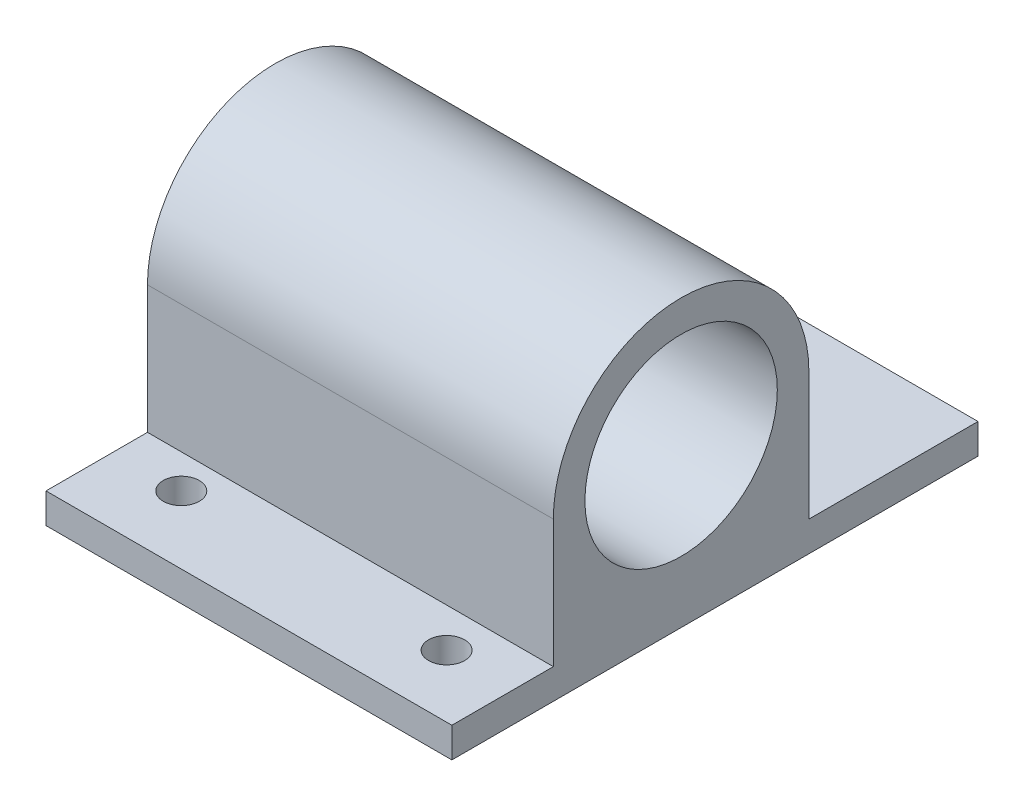
ISO-10303-21;
HEADER;
FILE_DESCRIPTION(('STEP AP214'),'2;1');
FILE_NAME('part.step','',(''),(''),'','','');
FILE_SCHEMA(('AUTOMOTIVE_DESIGN { 1 0 10303 214 1 1 1 1 }'));
ENDSEC;
DATA;
#1=APPLICATION_CONTEXT('core data for automotive mechanical design processes');
#2=APPLICATION_PROTOCOL_DEFINITION('international standard','automotive_design',2000,#1);
#3=PRODUCT_CONTEXT('',#1,'mechanical');
#4=PRODUCT('Part','Part','',(#3));
#5=PRODUCT_RELATED_PRODUCT_CATEGORY('part','',(#4));
#6=PRODUCT_DEFINITION_FORMATION('','',#4);
#7=PRODUCT_DEFINITION_CONTEXT('part definition',#1,'design');
#8=PRODUCT_DEFINITION('design','',#6,#7);
#9=PRODUCT_DEFINITION_SHAPE('','',#8);
#10=(LENGTH_UNIT() NAMED_UNIT(*) SI_UNIT(.MILLI.,.METRE.));
#11=(NAMED_UNIT(*) PLANE_ANGLE_UNIT() SI_UNIT($,.RADIAN.));
#12=(NAMED_UNIT(*) SI_UNIT($,.STERADIAN.) SOLID_ANGLE_UNIT());
#13=UNCERTAINTY_MEASURE_WITH_UNIT(LENGTH_MEASURE(1.E-05),#10,'distance_accuracy_value','');
#14=(GEOMETRIC_REPRESENTATION_CONTEXT(3) GLOBAL_UNCERTAINTY_ASSIGNED_CONTEXT((#13)) GLOBAL_UNIT_ASSIGNED_CONTEXT((#10,
#11,#12)) REPRESENTATION_CONTEXT('',''));
#15=CARTESIAN_POINT('',(0.,0.,0.));
#16=DIRECTION('',(0.,0.,1.));
#17=DIRECTION('',(1.,0.,0.));
#18=AXIS2_PLACEMENT_3D('',#15,#16,#17);
#19=CARTESIAN_POINT('',(-12.5119148377463,2.,0.));
#20=DIRECTION('',(-1.,0.,0.));
#21=DIRECTION('',(0.,0.,1.));
#22=AXIS2_PLACEMENT_3D('',#19,#20,#21);
#23=PLANE('',#22);
#24=CARTESIAN_POINT('',(-12.5119148377463,10.5,3.18980003319971));
#25=DIRECTION('',(1.,0.,0.));
#26=DIRECTION('',(0.,0.,-1.));
#27=AXIS2_PLACEMENT_3D('',#24,#25,#26);
#28=CIRCLE('',#27,6.4);
#29=CARTESIAN_POINT('',(-12.5119148377463,10.5,-3.21019996680029));
#30=VERTEX_POINT('',#29);
#31=EDGE_CURVE('E235',#30,#30,#28,.T.);
#32=ORIENTED_EDGE('',*,*,#31,.T.);
#33=EDGE_LOOP('',(#32));
#34=FACE_BOUND('',#33,.T.);
#35=DIRECTION('',(0.,-1.,0.));
#36=VECTOR('',#35,1.);
#37=CARTESIAN_POINT('',(-12.5119148377463,19.,11.6898000331997));
#38=LINE('',#37,#36);
#39=CARTESIAN_POINT('',(-12.5119148377463,10.5,11.6898000331997));
#40=VERTEX_POINT('',#39);
#41=CARTESIAN_POINT('',(-12.5119148377463,2.,11.6898000331997));
#42=VERTEX_POINT('',#41);
#43=EDGE_CURVE('E150',#40,#42,#38,.T.);
#44=ORIENTED_EDGE('',*,*,#43,.F.);
#45=CARTESIAN_POINT('',(-12.5119148377463,10.5,3.18980003319971));
#46=DIRECTION('',(1.,0.,0.));
#47=DIRECTION('',(0.,0.,-1.));
#48=AXIS2_PLACEMENT_3D('',#45,#46,#47);
#49=CIRCLE('',#48,8.5);
#50=CARTESIAN_POINT('',(-12.5119148377463,10.5,-5.31019996680029));
#51=VERTEX_POINT('',#50);
#52=EDGE_CURVE('E137',#51,#40,#49,.T.);
#53=ORIENTED_EDGE('',*,*,#52,.F.);
#54=DIRECTION('',(0.,-1.,0.));
#55=VECTOR('',#54,1.);
#56=CARTESIAN_POINT('',(-12.5119148377463,19.,-5.31019996680029));
#57=LINE('',#56,#55);
#58=CARTESIAN_POINT('',(-12.5119148377463,2.,-5.31019996680029));
#59=VERTEX_POINT('',#58);
#60=EDGE_CURVE('E156',#51,#59,#57,.T.);
#61=ORIENTED_EDGE('',*,*,#60,.T.);
#62=DIRECTION('',(0.,0.,-1.));
#63=VECTOR('',#62,1.);
#64=CARTESIAN_POINT('',(-12.5119148377463,2.,0.));
#65=LINE('',#64,#63);
#66=CARTESIAN_POINT('',(-12.5119148377463,2.,-16.5601999668003));
#67=VERTEX_POINT('',#66);
#68=EDGE_CURVE('E191',#59,#67,#65,.T.);
#69=ORIENTED_EDGE('',*,*,#68,.T.);
#70=DIRECTION('',(0.,-1.,0.));
#71=VECTOR('',#70,1.);
#72=CARTESIAN_POINT('',(-12.5119148377463,2.,-16.5601999668003));
#73=LINE('',#72,#71);
#74=CARTESIAN_POINT('',(-12.5119148377463,0.,-16.5601999668003));
#75=VERTEX_POINT('',#74);
#76=EDGE_CURVE('E200',#67,#75,#73,.T.);
#77=ORIENTED_EDGE('',*,*,#76,.T.);
#78=DIRECTION('',(0.,0.,-1.));
#79=VECTOR('',#78,1.);
#80=CARTESIAN_POINT('',(-12.5119148377463,0.,0.));
#81=LINE('',#80,#79);
#82=CARTESIAN_POINT('',(-12.5119148377463,0.,18.4398000331997));
#83=VERTEX_POINT('',#82);
#84=EDGE_CURVE('E188',#83,#75,#81,.T.);
#85=ORIENTED_EDGE('',*,*,#84,.F.);
#86=DIRECTION('',(0.,-1.,0.));
#87=VECTOR('',#86,1.);
#88=CARTESIAN_POINT('',(-12.5119148377463,2.,18.4398000331997));
#89=LINE('',#88,#87);
#90=CARTESIAN_POINT('',(-12.5119148377463,2.,18.4398000331997));
#91=VERTEX_POINT('',#90);
#92=EDGE_CURVE('E14',#91,#83,#89,.T.);
#93=ORIENTED_EDGE('',*,*,#92,.F.);
#94=EDGE_CURVE('E155',#91,#42,#65,.T.);
#95=ORIENTED_EDGE('',*,*,#94,.T.);
#96=EDGE_LOOP('',(#44,#53,#61,#69,#77,#85,#93,#95));
#97=FACE_BOUND('',#96,.T.);
#98=ADVANCED_FACE('F71',(#34,#97),#23,.T.);
#99=CARTESIAN_POINT('',(14.4880851622537,2.,0.));
#100=DIRECTION('',(-1.,0.,0.));
#101=DIRECTION('',(0.,0.,1.));
#102=AXIS2_PLACEMENT_3D('',#99,#100,#101);
#103=PLANE('',#102);
#104=CARTESIAN_POINT('',(14.4880851622537,10.5,3.18980003319971));
#105=DIRECTION('',(1.,0.,0.));
#106=DIRECTION('',(0.,0.,-1.));
#107=AXIS2_PLACEMENT_3D('',#104,#105,#106);
#108=CIRCLE('',#107,6.4);
#109=CARTESIAN_POINT('',(14.4880851622537,10.5,-3.21019996680029));
#110=VERTEX_POINT('',#109);
#111=EDGE_CURVE('E238',#110,#110,#108,.T.);
#112=ORIENTED_EDGE('',*,*,#111,.F.);
#113=EDGE_LOOP('',(#112));
#114=FACE_BOUND('',#113,.T.);
#115=CARTESIAN_POINT('',(14.4880851622537,10.5,3.18980003319971));
#116=DIRECTION('',(1.,0.,0.));
#117=DIRECTION('',(0.,0.,-1.));
#118=AXIS2_PLACEMENT_3D('',#115,#116,#117);
#119=CIRCLE('',#118,8.5);
#120=CARTESIAN_POINT('',(14.4880851622537,10.5,-5.31019996680029));
#121=VERTEX_POINT('',#120);
#122=CARTESIAN_POINT('',(14.4880851622537,10.5,11.6898000331997));
#123=VERTEX_POINT('',#122);
#124=EDGE_CURVE('E145',#121,#123,#119,.T.);
#125=ORIENTED_EDGE('',*,*,#124,.T.);
#126=DIRECTION('',(0.,-1.,0.));
#127=VECTOR('',#126,1.);
#128=CARTESIAN_POINT('',(14.4880851622537,19.,11.6898000331997));
#129=LINE('',#128,#127);
#130=CARTESIAN_POINT('',(14.4880851622537,2.,11.6898000331997));
#131=VERTEX_POINT('',#130);
#132=EDGE_CURVE('E93',#123,#131,#129,.T.);
#133=ORIENTED_EDGE('',*,*,#132,.T.);
#134=DIRECTION('',(0.,0.,-1.));
#135=VECTOR('',#134,1.);
#136=CARTESIAN_POINT('',(14.4880851622537,2.,0.));
#137=LINE('',#136,#135);
#138=CARTESIAN_POINT('',(14.4880851622537,2.,18.4398000331997));
#139=VERTEX_POINT('',#138);
#140=EDGE_CURVE('E195',#139,#131,#137,.T.);
#141=ORIENTED_EDGE('',*,*,#140,.F.);
#142=DIRECTION('',(0.,-1.,0.));
#143=VECTOR('',#142,1.);
#144=CARTESIAN_POINT('',(14.4880851622537,2.,18.4398000331997));
#145=LINE('',#144,#143);
#146=CARTESIAN_POINT('',(14.4880851622537,0.,18.4398000331997));
#147=VERTEX_POINT('',#146);
#148=EDGE_CURVE('E78',#139,#147,#145,.T.);
#149=ORIENTED_EDGE('',*,*,#148,.T.);
#150=DIRECTION('',(0.,0.,-1.));
#151=VECTOR('',#150,1.);
#152=CARTESIAN_POINT('',(14.4880851622537,0.,0.));
#153=LINE('',#152,#151);
#154=CARTESIAN_POINT('',(14.4880851622537,0.,-16.5601999668003));
#155=VERTEX_POINT('',#154);
#156=EDGE_CURVE('E206',#147,#155,#153,.T.);
#157=ORIENTED_EDGE('',*,*,#156,.T.);
#158=DIRECTION('',(0.,-1.,0.));
#159=VECTOR('',#158,1.);
#160=CARTESIAN_POINT('',(14.4880851622537,2.,-16.5601999668003));
#161=LINE('',#160,#159);
#162=CARTESIAN_POINT('',(14.4880851622537,2.,-16.5601999668003));
#163=VERTEX_POINT('',#162);
#164=EDGE_CURVE('E212',#163,#155,#161,.T.);
#165=ORIENTED_EDGE('',*,*,#164,.F.);
#166=CARTESIAN_POINT('',(14.4880851622537,2.,-5.31019996680029));
#167=VERTEX_POINT('',#166);
#168=EDGE_CURVE('E194',#167,#163,#137,.T.);
#169=ORIENTED_EDGE('',*,*,#168,.F.);
#170=DIRECTION('',(0.,-1.,0.));
#171=VECTOR('',#170,1.);
#172=CARTESIAN_POINT('',(14.4880851622537,19.,-5.31019996680029));
#173=LINE('',#172,#171);
#174=EDGE_CURVE('E85',#121,#167,#173,.T.);
#175=ORIENTED_EDGE('',*,*,#174,.F.);
#176=EDGE_LOOP('',(#125,#133,#141,#149,#157,#165,#169,#175));
#177=FACE_BOUND('',#176,.T.);
#178=ADVANCED_FACE('F215',(#114,#177),#103,.F.);
#179=CARTESIAN_POINT('',(14.4880851622537,19.,11.6898000331997));
#180=DIRECTION('',(0.,0.,-1.));
#181=DIRECTION('',(-1.,0.,0.));
#182=AXIS2_PLACEMENT_3D('',#179,#180,#181);
#183=PLANE('',#182);
#184=DIRECTION('',(1.,0.,0.));
#185=VECTOR('',#184,1.);
#186=CARTESIAN_POINT('',(-12.5119148377463,10.5,11.6898000331997));
#187=LINE('',#186,#185);
#188=EDGE_CURVE('E140',#40,#123,#187,.T.);
#189=ORIENTED_EDGE('',*,*,#188,.F.);
#190=ORIENTED_EDGE('',*,*,#43,.T.);
#191=DIRECTION('',(1.,0.,0.));
#192=VECTOR('',#191,1.);
#193=CARTESIAN_POINT('',(14.4880851622537,2.,11.6898000331997));
#194=LINE('',#193,#192);
#195=EDGE_CURVE('E159',#42,#131,#194,.T.);
#196=ORIENTED_EDGE('',*,*,#195,.T.);
#197=ORIENTED_EDGE('',*,*,#132,.F.);
#198=EDGE_LOOP('',(#189,#190,#196,#197));
#199=FACE_BOUND('',#198,.T.);
#200=ADVANCED_FACE('F148',(#199),#183,.F.);
#201=CARTESIAN_POINT('',(0.,2.,0.));
#202=DIRECTION('',(0.,1.,0.));
#203=DIRECTION('',(0.,0.,1.));
#204=AXIS2_PLACEMENT_3D('',#201,#202,#203);
#205=PLANE('',#204);
#206=ORIENTED_EDGE('',*,*,#195,.F.);
#207=ORIENTED_EDGE('',*,*,#94,.F.);
#208=DIRECTION('',(-1.,0.,0.));
#209=VECTOR('',#208,1.);
#210=CARTESIAN_POINT('',(0.,2.,18.4398000331997));
#211=LINE('',#210,#209);
#212=EDGE_CURVE('E190',#139,#91,#211,.T.);
#213=ORIENTED_EDGE('',*,*,#212,.F.);
#214=ORIENTED_EDGE('',*,*,#140,.T.);
#215=EDGE_LOOP('',(#206,#207,#213,#214));
#216=FACE_BOUND('',#215,.T.);
#217=CARTESIAN_POINT('',(9.98808516225372,2.,14.2918149466192));
#218=DIRECTION('',(0.,1.,0.));
#219=DIRECTION('',(0.,0.,1.));
#220=AXIS2_PLACEMENT_3D('',#217,#218,#219);
#221=CIRCLE('',#220,1.19999999999999);
#222=CARTESIAN_POINT('',(9.98808516225372,2.,15.4918149466192));
#223=VERTEX_POINT('',#222);
#224=EDGE_CURVE('E182',#223,#223,#221,.T.);
#225=ORIENTED_EDGE('',*,*,#224,.F.);
#226=EDGE_LOOP('',(#225));
#227=FACE_BOUND('',#226,.T.);
#228=CARTESIAN_POINT('',(-8.01191483774628,2.,13.9398000331997));
#229=DIRECTION('',(0.,1.,0.));
#230=DIRECTION('',(0.,0.,1.));
#231=AXIS2_PLACEMENT_3D('',#228,#229,#230);
#232=CIRCLE('',#231,1.19999999999999);
#233=CARTESIAN_POINT('',(-8.01191483774628,2.,15.1398000331997));
#234=VERTEX_POINT('',#233);
#235=EDGE_CURVE('E176',#234,#234,#232,.T.);
#236=ORIENTED_EDGE('',*,*,#235,.F.);
#237=EDGE_LOOP('',(#236));
#238=FACE_BOUND('',#237,.T.);
#239=ADVANCED_FACE('F274',(#216,#227,#238),#205,.T.);
#240=CARTESIAN_POINT('',(0.,2.,18.4398000331997));
#241=DIRECTION('',(0.,0.,1.));
#242=DIRECTION('',(1.,0.,0.));
#243=AXIS2_PLACEMENT_3D('',#240,#241,#242);
#244=PLANE('',#243);
#245=DIRECTION('',(-1.,0.,0.));
#246=VECTOR('',#245,1.);
#247=CARTESIAN_POINT('',(0.,0.,18.4398000331997));
#248=LINE('',#247,#246);
#249=EDGE_CURVE('E203',#147,#83,#248,.T.);
#250=ORIENTED_EDGE('',*,*,#249,.F.);
#251=ORIENTED_EDGE('',*,*,#148,.F.);
#252=ORIENTED_EDGE('',*,*,#212,.T.);
#253=ORIENTED_EDGE('',*,*,#92,.T.);
#254=EDGE_LOOP('',(#250,#251,#252,#253));
#255=FACE_BOUND('',#254,.T.);
#256=ADVANCED_FACE('F223',(#255),#244,.T.);
#257=CARTESIAN_POINT('',(0.,2.,-16.5601999668003));
#258=DIRECTION('',(0.,0.,1.));
#259=DIRECTION('',(1.,0.,0.));
#260=AXIS2_PLACEMENT_3D('',#257,#258,#259);
#261=PLANE('',#260);
#262=DIRECTION('',(-1.,0.,0.));
#263=VECTOR('',#262,1.);
#264=CARTESIAN_POINT('',(0.,0.,-16.5601999668003));
#265=LINE('',#264,#263);
#266=EDGE_CURVE('E208',#155,#75,#265,.T.);
#267=ORIENTED_EDGE('',*,*,#266,.T.);
#268=ORIENTED_EDGE('',*,*,#76,.F.);
#269=DIRECTION('',(-1.,0.,0.));
#270=VECTOR('',#269,1.);
#271=CARTESIAN_POINT('',(0.,2.,-16.5601999668003));
#272=LINE('',#271,#270);
#273=EDGE_CURVE('E197',#163,#67,#272,.T.);
#274=ORIENTED_EDGE('',*,*,#273,.F.);
#275=ORIENTED_EDGE('',*,*,#164,.T.);
#276=EDGE_LOOP('',(#267,#268,#274,#275));
#277=FACE_BOUND('',#276,.T.);
#278=ADVANCED_FACE('F229',(#277),#261,.F.);
#279=DIRECTION('',(-1.,0.,0.));
#280=VECTOR('',#279,1.);
#281=CARTESIAN_POINT('',(14.4880851622537,2.,-5.31019996680029));
#282=LINE('',#281,#280);
#283=EDGE_CURVE('E234',#167,#59,#282,.T.);
#284=ORIENTED_EDGE('',*,*,#283,.F.);
#285=ORIENTED_EDGE('',*,*,#168,.T.);
#286=ORIENTED_EDGE('',*,*,#273,.T.);
#287=ORIENTED_EDGE('',*,*,#68,.F.);
#288=EDGE_LOOP('',(#284,#285,#286,#287));
#289=FACE_BOUND('',#288,.T.);
#290=CARTESIAN_POINT('',(-8.01191483774628,2.,-7.56019996680029));
#291=DIRECTION('',(0.,1.,0.));
#292=DIRECTION('',(0.,0.,1.));
#293=AXIS2_PLACEMENT_3D('',#290,#291,#292);
#294=CIRCLE('',#293,1.19999999999999);
#295=CARTESIAN_POINT('',(-8.01191483774628,2.,-6.3601999668003));
#296=VERTEX_POINT('',#295);
#297=EDGE_CURVE('E164',#296,#296,#294,.T.);
#298=ORIENTED_EDGE('',*,*,#297,.F.);
#299=EDGE_LOOP('',(#298));
#300=FACE_BOUND('',#299,.T.);
#301=CARTESIAN_POINT('',(9.98808516225371,2.,-7.56019996680029));
#302=DIRECTION('',(0.,1.,0.));
#303=DIRECTION('',(0.,0.,1.));
#304=AXIS2_PLACEMENT_3D('',#301,#302,#303);
#305=CIRCLE('',#304,1.19999999999999);
#306=CARTESIAN_POINT('',(9.98808516225371,2.,-6.3601999668003));
#307=VERTEX_POINT('',#306);
#308=EDGE_CURVE('E170',#307,#307,#305,.T.);
#309=ORIENTED_EDGE('',*,*,#308,.F.);
#310=EDGE_LOOP('',(#309));
#311=FACE_BOUND('',#310,.T.);
#312=ADVANCED_FACE('F232',(#289,#300,#311),#205,.T.);
#313=CARTESIAN_POINT('',(0.,0.,0.));
#314=DIRECTION('',(0.,1.,0.));
#315=DIRECTION('',(0.,0.,1.));
#316=AXIS2_PLACEMENT_3D('',#313,#314,#315);
#317=PLANE('',#316);
#318=CARTESIAN_POINT('',(-8.01191483774628,0.,-7.56019996680029));
#319=DIRECTION('',(0.,1.,0.));
#320=DIRECTION('',(0.,0.,1.));
#321=AXIS2_PLACEMENT_3D('',#318,#319,#320);
#322=CIRCLE('',#321,1.2);
#323=CARTESIAN_POINT('',(-8.01191483774628,0.,-6.36019996680029));
#324=VERTEX_POINT('',#323);
#325=EDGE_CURVE('E167',#324,#324,#322,.T.);
#326=ORIENTED_EDGE('',*,*,#325,.T.);
#327=EDGE_LOOP('',(#326));
#328=FACE_BOUND('',#327,.T.);
#329=CARTESIAN_POINT('',(9.98808516225371,0.,-7.56019996680029));
#330=DIRECTION('',(0.,1.,0.));
#331=DIRECTION('',(0.,0.,1.));
#332=AXIS2_PLACEMENT_3D('',#329,#330,#331);
#333=CIRCLE('',#332,1.2);
#334=CARTESIAN_POINT('',(9.98808516225371,0.,-6.36019996680029));
#335=VERTEX_POINT('',#334);
#336=EDGE_CURVE('E173',#335,#335,#333,.T.);
#337=ORIENTED_EDGE('',*,*,#336,.T.);
#338=EDGE_LOOP('',(#337));
#339=FACE_BOUND('',#338,.T.);
#340=CARTESIAN_POINT('',(-8.01191483774628,0.,13.9398000331997));
#341=DIRECTION('',(0.,1.,0.));
#342=DIRECTION('',(0.,0.,1.));
#343=AXIS2_PLACEMENT_3D('',#340,#341,#342);
#344=CIRCLE('',#343,1.2);
#345=CARTESIAN_POINT('',(-8.01191483774628,0.,15.1398000331997));
#346=VERTEX_POINT('',#345);
#347=EDGE_CURVE('E179',#346,#346,#344,.T.);
#348=ORIENTED_EDGE('',*,*,#347,.T.);
#349=EDGE_LOOP('',(#348));
#350=FACE_BOUND('',#349,.T.);
#351=CARTESIAN_POINT('',(9.98808516225372,0.,14.2918149466192));
#352=DIRECTION('',(0.,1.,0.));
#353=DIRECTION('',(0.,0.,1.));
#354=AXIS2_PLACEMENT_3D('',#351,#352,#353);
#355=CIRCLE('',#354,1.2);
#356=CARTESIAN_POINT('',(9.98808516225372,0.,15.4918149466192));
#357=VERTEX_POINT('',#356);
#358=EDGE_CURVE('E185',#357,#357,#355,.T.);
#359=ORIENTED_EDGE('',*,*,#358,.T.);
#360=EDGE_LOOP('',(#359));
#361=FACE_BOUND('',#360,.T.);
#362=ORIENTED_EDGE('',*,*,#84,.T.);
#363=ORIENTED_EDGE('',*,*,#266,.F.);
#364=ORIENTED_EDGE('',*,*,#156,.F.);
#365=ORIENTED_EDGE('',*,*,#249,.T.);
#366=EDGE_LOOP('',(#362,#363,#364,#365));
#367=FACE_BOUND('',#366,.T.);
#368=ADVANCED_FACE('F222',(#328,#339,#350,#361,#367),#317,.F.);
#369=CARTESIAN_POINT('',(9.98808516225372,2.,14.2918149466192));
#370=DIRECTION('',(0.,1.,0.));
#371=DIRECTION('',(0.,0.,1.));
#372=AXIS2_PLACEMENT_3D('',#369,#370,#371);
#373=CYLINDRICAL_SURFACE('',#372,1.19999999999999);
#374=ORIENTED_EDGE('',*,*,#358,.F.);
#375=EDGE_LOOP('',(#374));
#376=FACE_BOUND('',#375,.T.);
#377=ORIENTED_EDGE('',*,*,#224,.T.);
#378=EDGE_LOOP('',(#377));
#379=FACE_BOUND('',#378,.T.);
#380=ADVANCED_FACE('F291',(#376,#379),#373,.F.);
#381=CARTESIAN_POINT('',(-8.01191483774628,2.,13.9398000331997));
#382=DIRECTION('',(0.,1.,0.));
#383=DIRECTION('',(0.,0.,1.));
#384=AXIS2_PLACEMENT_3D('',#381,#382,#383);
#385=CYLINDRICAL_SURFACE('',#384,1.19999999999999);
#386=ORIENTED_EDGE('',*,*,#347,.F.);
#387=EDGE_LOOP('',(#386));
#388=FACE_BOUND('',#387,.T.);
#389=ORIENTED_EDGE('',*,*,#235,.T.);
#390=EDGE_LOOP('',(#389));
#391=FACE_BOUND('',#390,.T.);
#392=ADVANCED_FACE('F321',(#388,#391),#385,.F.);
#393=CARTESIAN_POINT('',(9.98808516225371,2.,-7.56019996680029));
#394=DIRECTION('',(0.,1.,0.));
#395=DIRECTION('',(0.,0.,1.));
#396=AXIS2_PLACEMENT_3D('',#393,#394,#395);
#397=CYLINDRICAL_SURFACE('',#396,1.19999999999999);
#398=ORIENTED_EDGE('',*,*,#336,.F.);
#399=EDGE_LOOP('',(#398));
#400=FACE_BOUND('',#399,.T.);
#401=ORIENTED_EDGE('',*,*,#308,.T.);
#402=EDGE_LOOP('',(#401));
#403=FACE_BOUND('',#402,.T.);
#404=ADVANCED_FACE('F254',(#400,#403),#397,.F.);
#405=CARTESIAN_POINT('',(-8.01191483774628,2.,-7.56019996680029));
#406=DIRECTION('',(0.,1.,0.));
#407=DIRECTION('',(0.,0.,1.));
#408=AXIS2_PLACEMENT_3D('',#405,#406,#407);
#409=CYLINDRICAL_SURFACE('',#408,1.19999999999999);
#410=ORIENTED_EDGE('',*,*,#325,.F.);
#411=EDGE_LOOP('',(#410));
#412=FACE_BOUND('',#411,.T.);
#413=ORIENTED_EDGE('',*,*,#297,.T.);
#414=EDGE_LOOP('',(#413));
#415=FACE_BOUND('',#414,.T.);
#416=ADVANCED_FACE('F246',(#412,#415),#409,.F.);
#417=CARTESIAN_POINT('',(14.4880851622537,19.,-5.31019996680029));
#418=DIRECTION('',(0.,0.,1.));
#419=DIRECTION('',(1.,0.,0.));
#420=AXIS2_PLACEMENT_3D('',#417,#418,#419);
#421=PLANE('',#420);
#422=ORIENTED_EDGE('',*,*,#60,.F.);
#423=DIRECTION('',(1.,0.,0.));
#424=VECTOR('',#423,1.);
#425=CARTESIAN_POINT('',(-12.5119148377463,10.5,-5.31019996680029));
#426=LINE('',#425,#424);
#427=EDGE_CURVE('E141',#51,#121,#426,.T.);
#428=ORIENTED_EDGE('',*,*,#427,.T.);
#429=ORIENTED_EDGE('',*,*,#174,.T.);
#430=ORIENTED_EDGE('',*,*,#283,.T.);
#431=EDGE_LOOP('',(#422,#428,#429,#430));
#432=FACE_BOUND('',#431,.T.);
#433=ADVANCED_FACE('F244',(#432),#421,.F.);
#434=CARTESIAN_POINT('',(-12.5119148377463,10.5,3.18980003319971));
#435=DIRECTION('',(1.,0.,0.));
#436=DIRECTION('',(0.,0.,-1.));
#437=AXIS2_PLACEMENT_3D('',#434,#435,#436);
#438=CYLINDRICAL_SURFACE('',#437,8.5);
#439=ORIENTED_EDGE('',*,*,#124,.F.);
#440=ORIENTED_EDGE('',*,*,#427,.F.);
#441=ORIENTED_EDGE('',*,*,#52,.T.);
#442=ORIENTED_EDGE('',*,*,#188,.T.);
#443=EDGE_LOOP('',(#439,#440,#441,#442));
#444=FACE_BOUND('',#443,.T.);
#445=ADVANCED_FACE('F139',(#444),#438,.T.);
#446=CARTESIAN_POINT('',(-12.5119148377463,10.5,3.18980003319971));
#447=DIRECTION('',(1.,0.,0.));
#448=DIRECTION('',(0.,0.,-1.));
#449=AXIS2_PLACEMENT_3D('',#446,#447,#448);
#450=CYLINDRICAL_SURFACE('',#449,6.4);
#451=ORIENTED_EDGE('',*,*,#31,.F.);
#452=EDGE_LOOP('',(#451));
#453=FACE_BOUND('',#452,.T.);
#454=ORIENTED_EDGE('',*,*,#111,.T.);
#455=EDGE_LOOP('',(#454));
#456=FACE_BOUND('',#455,.T.);
#457=ADVANCED_FACE('F252',(#453,#456),#450,.F.);
#458=CLOSED_SHELL('',(#98,#178,#200,#239,#256,#278,#312,#368,#380,#392,#404,#416,#433,#445,#457));
#459=MANIFOLD_SOLID_BREP('B2',#458);
#460=ADVANCED_BREP_SHAPE_REPRESENTATION('',(#18,#459),#14);
#461=SHAPE_DEFINITION_REPRESENTATION(#9,#460);
ENDSEC;
END-ISO-10303-21;
